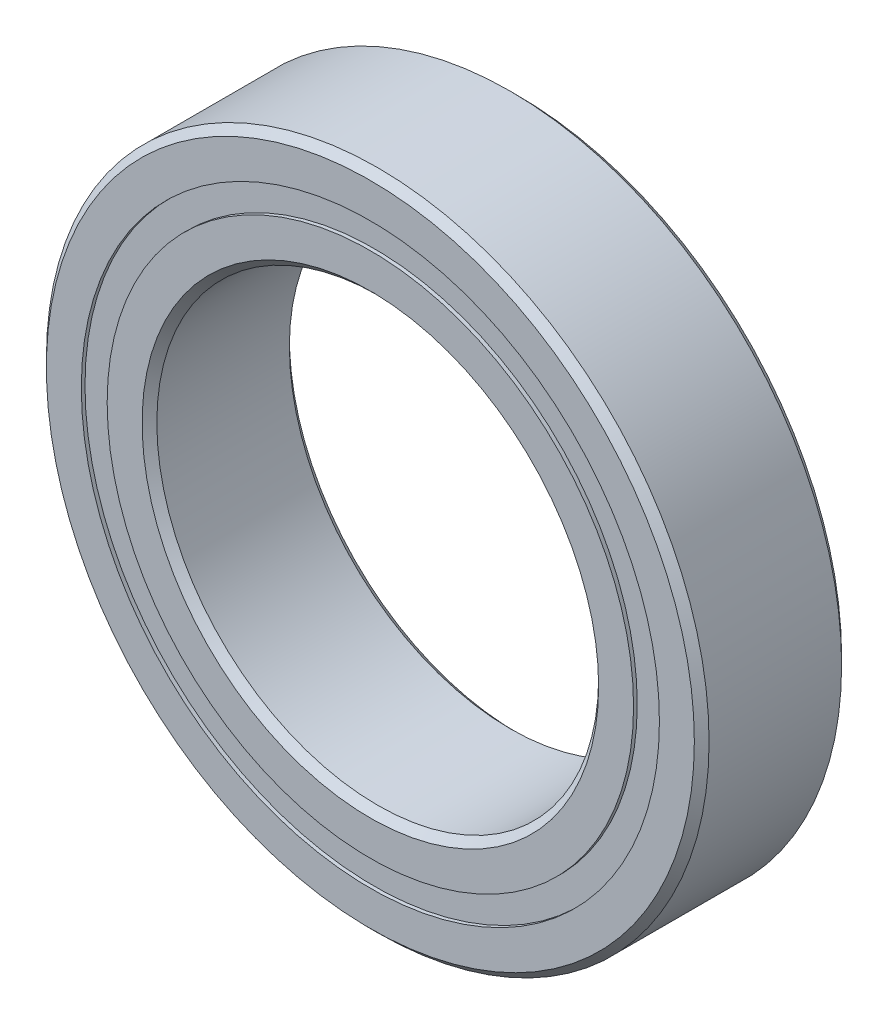
ISO-10303-21;
HEADER;
FILE_DESCRIPTION(('STEP AP214'),'2;1');
FILE_NAME('part.step','',(''),(''),'','','');
FILE_SCHEMA(('AUTOMOTIVE_DESIGN { 1 0 10303 214 1 1 1 1 }'));
ENDSEC;
DATA;
#1=APPLICATION_CONTEXT('core data for automotive mechanical design processes');
#2=APPLICATION_PROTOCOL_DEFINITION('international standard','automotive_design',2000,#1);
#3=PRODUCT_CONTEXT('',#1,'mechanical');
#4=PRODUCT('Part','Part','',(#3));
#5=PRODUCT_RELATED_PRODUCT_CATEGORY('part','',(#4));
#6=PRODUCT_DEFINITION_FORMATION('','',#4);
#7=PRODUCT_DEFINITION_CONTEXT('part definition',#1,'design');
#8=PRODUCT_DEFINITION('design','',#6,#7);
#9=PRODUCT_DEFINITION_SHAPE('','',#8);
#10=(LENGTH_UNIT() NAMED_UNIT(*) SI_UNIT(.MILLI.,.METRE.));
#11=(NAMED_UNIT(*) PLANE_ANGLE_UNIT() SI_UNIT($,.RADIAN.));
#12=(NAMED_UNIT(*) SI_UNIT($,.STERADIAN.) SOLID_ANGLE_UNIT());
#13=UNCERTAINTY_MEASURE_WITH_UNIT(LENGTH_MEASURE(1.E-05),#10,'distance_accuracy_value','');
#14=(GEOMETRIC_REPRESENTATION_CONTEXT(3) GLOBAL_UNCERTAINTY_ASSIGNED_CONTEXT((#13)) GLOBAL_UNIT_ASSIGNED_CONTEXT((#10,
#11,#12)) REPRESENTATION_CONTEXT('',''));
#15=CARTESIAN_POINT('',(0.,0.,0.));
#16=DIRECTION('',(0.,0.,1.));
#17=DIRECTION('',(1.,0.,0.));
#18=AXIS2_PLACEMENT_3D('',#15,#16,#17);
#19=CARTESIAN_POINT('',(0.,7.85114806931288,-1.90000000000001));
#20=DIRECTION('',(0.,0.,1.));
#21=DIRECTION('',(1.,0.,0.));
#22=AXIS2_PLACEMENT_3D('',#19,#20,#21);
#23=PLANE('',#22);
#24=CARTESIAN_POINT('',(0.,0.,-1.90000000000001));
#25=DIRECTION('',(0.,0.,1.));
#26=DIRECTION('',(1.,0.,0.));
#27=AXIS2_PLACEMENT_3D('',#24,#25,#26);
#28=CIRCLE('',#27,7.85114806931288);
#29=CARTESIAN_POINT('',(7.85114806931288,0.,-1.90000000000001));
#30=VERTEX_POINT('',#29);
#31=EDGE_CURVE('E57',#30,#30,#28,.T.);
#32=ORIENTED_EDGE('',*,*,#31,.F.);
#33=EDGE_LOOP('',(#32));
#34=FACE_BOUND('',#33,.T.);
#35=CARTESIAN_POINT('',(0.,0.,-1.90000000000001));
#36=DIRECTION('',(0.,0.,1.));
#37=DIRECTION('',(1.,0.,0.));
#38=AXIS2_PLACEMENT_3D('',#35,#36,#37);
#39=CIRCLE('',#38,7.14885193068713);
#40=CARTESIAN_POINT('',(7.14885193068713,0.,-1.90000000000001));
#41=VERTEX_POINT('',#40);
#42=EDGE_CURVE('E11',#41,#41,#39,.T.);
#43=ORIENTED_EDGE('',*,*,#42,.T.);
#44=EDGE_LOOP('',(#43));
#45=FACE_BOUND('',#44,.T.);
#46=ADVANCED_FACE('F43',(#34,#45),#23,.F.);
#47=CARTESIAN_POINT('',(0.,0.,2.));
#48=DIRECTION('',(0.,0.,1.));
#49=DIRECTION('',(1.,0.,0.));
#50=AXIS2_PLACEMENT_3D('',#47,#48,#49);
#51=CYLINDRICAL_SURFACE('',#50,7.14885193068713);
#52=ORIENTED_EDGE('',*,*,#42,.F.);
#53=EDGE_LOOP('',(#52));
#54=FACE_BOUND('',#53,.T.);
#55=CARTESIAN_POINT('',(0.,0.,-0.803751779515634));
#56=DIRECTION('',(0.,0.,1.));
#57=DIRECTION('',(1.,0.,0.));
#58=AXIS2_PLACEMENT_3D('',#55,#56,#57);
#59=CIRCLE('',#58,7.14885193068713);
#60=CARTESIAN_POINT('',(7.14885193068713,0.,-0.803751779515634));
#61=VERTEX_POINT('',#60);
#62=EDGE_CURVE('E49',#61,#61,#59,.T.);
#63=ORIENTED_EDGE('',*,*,#62,.T.);
#64=EDGE_LOOP('',(#63));
#65=FACE_BOUND('',#64,.T.);
#66=ADVANCED_FACE('F66',(#54,#65),#51,.F.);
#67=CARTESIAN_POINT('',(0.,7.85114806931288,-0.803751779515634));
#68=DIRECTION('',(0.,0.,-1.));
#69=DIRECTION('',(-1.,0.,0.));
#70=AXIS2_PLACEMENT_3D('',#67,#68,#69);
#71=PLANE('',#70);
#72=ORIENTED_EDGE('',*,*,#62,.F.);
#73=EDGE_LOOP('',(#72));
#74=FACE_BOUND('',#73,.T.);
#75=CARTESIAN_POINT('',(0.,0.,-0.803751779515634));
#76=DIRECTION('',(0.,0.,1.));
#77=DIRECTION('',(1.,0.,0.));
#78=AXIS2_PLACEMENT_3D('',#75,#76,#77);
#79=CIRCLE('',#78,7.85114806931288);
#80=CARTESIAN_POINT('',(7.85114806931288,0.,-0.803751779515634));
#81=VERTEX_POINT('',#80);
#82=EDGE_CURVE('E53',#81,#81,#79,.T.);
#83=ORIENTED_EDGE('',*,*,#82,.T.);
#84=EDGE_LOOP('',(#83));
#85=FACE_BOUND('',#84,.T.);
#86=ADVANCED_FACE('F70',(#74,#85),#71,.F.);
#87=CARTESIAN_POINT('',(0.,0.,2.));
#88=DIRECTION('',(0.,0.,1.));
#89=DIRECTION('',(1.,0.,0.));
#90=AXIS2_PLACEMENT_3D('',#87,#88,#89);
#91=CYLINDRICAL_SURFACE('',#90,7.85114806931288);
#92=ORIENTED_EDGE('',*,*,#82,.F.);
#93=EDGE_LOOP('',(#92));
#94=FACE_BOUND('',#93,.T.);
#95=ORIENTED_EDGE('',*,*,#31,.T.);
#96=EDGE_LOOP('',(#95));
#97=FACE_BOUND('',#96,.T.);
#98=ADVANCED_FACE('F63',(#94,#97),#91,.T.);
#99=CLOSED_SHELL('',(#46,#66,#86,#98));
#100=MANIFOLD_SOLID_BREP('B2',#99);
#101=CARTESIAN_POINT('',(0.,7.85114806931288,1.9));
#102=DIRECTION('',(0.,0.,-1.));
#103=DIRECTION('',(-1.,0.,0.));
#104=AXIS2_PLACEMENT_3D('',#101,#102,#103);
#105=PLANE('',#104);
#106=CARTESIAN_POINT('',(0.,0.,1.9));
#107=DIRECTION('',(0.,0.,1.));
#108=DIRECTION('',(1.,0.,0.));
#109=AXIS2_PLACEMENT_3D('',#106,#107,#108);
#110=CIRCLE('',#109,7.14885193068713);
#111=CARTESIAN_POINT('',(7.14885193068713,0.,1.9));
#112=VERTEX_POINT('',#111);
#113=EDGE_CURVE('E42',#112,#112,#110,.T.);
#114=ORIENTED_EDGE('',*,*,#113,.F.);
#115=EDGE_LOOP('',(#114));
#116=FACE_BOUND('',#115,.T.);
#117=CARTESIAN_POINT('',(0.,0.,1.9));
#118=DIRECTION('',(0.,0.,1.));
#119=DIRECTION('',(1.,0.,0.));
#120=AXIS2_PLACEMENT_3D('',#117,#118,#119);
#121=CIRCLE('',#120,7.85114806931288);
#122=CARTESIAN_POINT('',(7.85114806931288,0.,1.9));
#123=VERTEX_POINT('',#122);
#124=EDGE_CURVE('E124',#123,#123,#121,.T.);
#125=ORIENTED_EDGE('',*,*,#124,.T.);
#126=EDGE_LOOP('',(#125));
#127=FACE_BOUND('',#126,.T.);
#128=ADVANCED_FACE('F110',(#116,#127),#105,.F.);
#129=CARTESIAN_POINT('',(0.,0.,2.));
#130=DIRECTION('',(0.,0.,1.));
#131=DIRECTION('',(1.,0.,0.));
#132=AXIS2_PLACEMENT_3D('',#129,#130,#131);
#133=CYLINDRICAL_SURFACE('',#132,7.14885193068713);
#134=CARTESIAN_POINT('',(0.,0.,0.80375177951563));
#135=DIRECTION('',(0.,0.,1.));
#136=DIRECTION('',(1.,0.,0.));
#137=AXIS2_PLACEMENT_3D('',#134,#135,#136);
#138=CIRCLE('',#137,7.14885193068713);
#139=CARTESIAN_POINT('',(7.14885193068713,0.,0.80375177951563));
#140=VERTEX_POINT('',#139);
#141=EDGE_CURVE('E116',#140,#140,#138,.T.);
#142=ORIENTED_EDGE('',*,*,#141,.F.);
#143=EDGE_LOOP('',(#142));
#144=FACE_BOUND('',#143,.T.);
#145=ORIENTED_EDGE('',*,*,#113,.T.);
#146=EDGE_LOOP('',(#145));
#147=FACE_BOUND('',#146,.T.);
#148=ADVANCED_FACE('F139',(#144,#147),#133,.F.);
#149=CARTESIAN_POINT('',(0.,7.85114806931288,0.80375177951563));
#150=DIRECTION('',(0.,0.,1.));
#151=DIRECTION('',(1.,0.,0.));
#152=AXIS2_PLACEMENT_3D('',#149,#150,#151);
#153=PLANE('',#152);
#154=CARTESIAN_POINT('',(0.,0.,0.80375177951563));
#155=DIRECTION('',(0.,0.,1.));
#156=DIRECTION('',(1.,0.,0.));
#157=AXIS2_PLACEMENT_3D('',#154,#155,#156);
#158=CIRCLE('',#157,7.85114806931288);
#159=CARTESIAN_POINT('',(7.85114806931288,0.,0.80375177951563));
#160=VERTEX_POINT('',#159);
#161=EDGE_CURVE('E120',#160,#160,#158,.T.);
#162=ORIENTED_EDGE('',*,*,#161,.F.);
#163=EDGE_LOOP('',(#162));
#164=FACE_BOUND('',#163,.T.);
#165=ORIENTED_EDGE('',*,*,#141,.T.);
#166=EDGE_LOOP('',(#165));
#167=FACE_BOUND('',#166,.T.);
#168=ADVANCED_FACE('F134',(#164,#167),#153,.F.);
#169=CARTESIAN_POINT('',(0.,0.,2.));
#170=DIRECTION('',(0.,0.,1.));
#171=DIRECTION('',(1.,0.,0.));
#172=AXIS2_PLACEMENT_3D('',#169,#170,#171);
#173=CYLINDRICAL_SURFACE('',#172,7.85114806931288);
#174=ORIENTED_EDGE('',*,*,#124,.F.);
#175=EDGE_LOOP('',(#174));
#176=FACE_BOUND('',#175,.T.);
#177=ORIENTED_EDGE('',*,*,#161,.T.);
#178=EDGE_LOOP('',(#177));
#179=FACE_BOUND('',#178,.T.);
#180=ADVANCED_FACE('F131',(#176,#179),#173,.T.);
#181=CLOSED_SHELL('',(#128,#148,#168,#180));
#182=MANIFOLD_SOLID_BREP('B6',#181);
#183=CARTESIAN_POINT('',(-3.77557403465635,6.53948605576281,0.));
#184=DIRECTION('',(0.,0.,1.));
#185=DIRECTION('',(-0.499999999999989,0.866025403784445,0.));
#186=AXIS2_PLACEMENT_3D('',#183,#184,#185);
#187=SPHERICAL_SURFACE('',#186,0.803751779515632);
#188=CARTESIAN_POINT('',(-3.77557403465635,6.53948605576281,0.80375177951563));
#189=VERTEX_POINT('',#188);
#190=VERTEX_LOOP('',#189);
#191=FACE_BOUND('',#190,.T.);
#192=ADVANCED_FACE('F177',(#191),#187,.T.);
#193=CLOSED_SHELL('',(#192));
#194=MANIFOLD_SOLID_BREP('B37',#193);
#195=CARTESIAN_POINT('',(-6.53948605576272,3.77557403465651,0.));
#196=DIRECTION('',(0.,0.,1.));
#197=DIRECTION('',(-0.866025403784433,0.50000000000001,0.));
#198=AXIS2_PLACEMENT_3D('',#195,#196,#197);
#199=SPHERICAL_SURFACE('',#198,0.803751779515632);
#200=CARTESIAN_POINT('',(-6.53948605576272,3.77557403465651,0.80375177951563));
#201=VERTEX_POINT('',#200);
#202=VERTEX_LOOP('',#201);
#203=FACE_BOUND('',#202,.T.);
#204=ADVANCED_FACE('F197',(#203),#199,.T.);
#205=CLOSED_SHELL('',(#204));
#206=MANIFOLD_SOLID_BREP('B106',#205);
#207=CARTESIAN_POINT('',(-7.55114806931288,0.,0.));
#208=DIRECTION('',(0.,0.,1.));
#209=DIRECTION('',(-1.,0.,0.));
#210=AXIS2_PLACEMENT_3D('',#207,#208,#209);
#211=SPHERICAL_SURFACE('',#210,0.803751779515632);
#212=CARTESIAN_POINT('',(-7.55114806931288,0.,0.80375177951563));
#213=VERTEX_POINT('',#212);
#214=VERTEX_LOOP('',#213);
#215=FACE_BOUND('',#214,.T.);
#216=ADVANCED_FACE('F217',(#215),#211,.T.);
#217=CLOSED_SHELL('',(#216));
#218=MANIFOLD_SOLID_BREP('B173',#217);
#219=CARTESIAN_POINT('',(-6.5394860557628,-3.77557403465638,0.));
#220=DIRECTION('',(0.,0.,1.));
#221=DIRECTION('',(-0.866025403784443,-0.499999999999992,0.));
#222=AXIS2_PLACEMENT_3D('',#219,#220,#221);
#223=SPHERICAL_SURFACE('',#222,0.803751779515632);
#224=CARTESIAN_POINT('',(-6.5394860557628,-3.77557403465638,0.80375177951563));
#225=VERTEX_POINT('',#224);
#226=VERTEX_LOOP('',#225);
#227=FACE_BOUND('',#226,.T.);
#228=ADVANCED_FACE('F237',(#227),#223,.T.);
#229=CLOSED_SHELL('',(#228));
#230=MANIFOLD_SOLID_BREP('B193',#229);
#231=CARTESIAN_POINT('',(-3.77557403465649,-6.53948605576274,0.));
#232=DIRECTION('',(0.,0.,1.));
#233=DIRECTION('',(-0.500000000000007,-0.866025403784435,0.));
#234=AXIS2_PLACEMENT_3D('',#231,#232,#233);
#235=SPHERICAL_SURFACE('',#234,0.803751779515632);
#236=CARTESIAN_POINT('',(-3.77557403465649,-6.53948605576274,0.80375177951563));
#237=VERTEX_POINT('',#236);
#238=VERTEX_LOOP('',#237);
#239=FACE_BOUND('',#238,.T.);
#240=ADVANCED_FACE('F257',(#239),#235,.T.);
#241=CLOSED_SHELL('',(#240));
#242=MANIFOLD_SOLID_BREP('B213',#241);
#243=CARTESIAN_POINT('',(0.,-7.55114806931288,0.));
#244=DIRECTION('',(0.,0.,1.));
#245=DIRECTION('',(0.,-1.,0.));
#246=AXIS2_PLACEMENT_3D('',#243,#244,#245);
#247=SPHERICAL_SURFACE('',#246,0.803751779515632);
#248=CARTESIAN_POINT('',(0.,-7.55114806931288,0.80375177951563));
#249=VERTEX_POINT('',#248);
#250=VERTEX_LOOP('',#249);
#251=FACE_BOUND('',#250,.T.);
#252=ADVANCED_FACE('F277',(#251),#247,.T.);
#253=CLOSED_SHELL('',(#252));
#254=MANIFOLD_SOLID_BREP('B233',#253);
#255=CARTESIAN_POINT('',(3.7755740346564,-6.53948605576279,0.));
#256=DIRECTION('',(0.,0.,1.));
#257=DIRECTION('',(0.499999999999995,-0.866025403784442,0.));
#258=AXIS2_PLACEMENT_3D('',#255,#256,#257);
#259=SPHERICAL_SURFACE('',#258,0.803751779515632);
#260=CARTESIAN_POINT('',(3.7755740346564,-6.53948605576279,0.80375177951563));
#261=VERTEX_POINT('',#260);
#262=VERTEX_LOOP('',#261);
#263=FACE_BOUND('',#262,.T.);
#264=ADVANCED_FACE('F297',(#263),#259,.T.);
#265=CLOSED_SHELL('',(#264));
#266=MANIFOLD_SOLID_BREP('B253',#265);
#267=CARTESIAN_POINT('',(6.53948605576275,-3.77557403465647,0.));
#268=DIRECTION('',(0.,0.,1.));
#269=DIRECTION('',(0.866025403784436,-0.500000000000004,0.));
#270=AXIS2_PLACEMENT_3D('',#267,#268,#269);
#271=SPHERICAL_SURFACE('',#270,0.803751779515632);
#272=CARTESIAN_POINT('',(6.53948605576275,-3.77557403465647,0.80375177951563));
#273=VERTEX_POINT('',#272);
#274=VERTEX_LOOP('',#273);
#275=FACE_BOUND('',#274,.T.);
#276=ADVANCED_FACE('F317',(#275),#271,.T.);
#277=CLOSED_SHELL('',(#276));
#278=MANIFOLD_SOLID_BREP('B273',#277);
#279=CARTESIAN_POINT('',(7.55114806931288,0.,0.));
#280=DIRECTION('',(0.,0.,1.));
#281=DIRECTION('',(1.,0.,0.));
#282=AXIS2_PLACEMENT_3D('',#279,#280,#281);
#283=SPHERICAL_SURFACE('',#282,0.803751779515632);
#284=CARTESIAN_POINT('',(7.55114806931288,0.,0.80375177951563));
#285=VERTEX_POINT('',#284);
#286=VERTEX_LOOP('',#285);
#287=FACE_BOUND('',#286,.T.);
#288=ADVANCED_FACE('F337',(#287),#283,.T.);
#289=CLOSED_SHELL('',(#288));
#290=MANIFOLD_SOLID_BREP('B293',#289);
#291=CARTESIAN_POINT('',(6.53948605576278,3.77557403465642,0.));
#292=DIRECTION('',(0.,0.,1.));
#293=DIRECTION('',(0.86602540378444,0.499999999999998,0.));
#294=AXIS2_PLACEMENT_3D('',#291,#292,#293);
#295=SPHERICAL_SURFACE('',#294,0.803751779515632);
#296=CARTESIAN_POINT('',(6.53948605576278,3.77557403465642,0.80375177951563));
#297=VERTEX_POINT('',#296);
#298=VERTEX_LOOP('',#297);
#299=FACE_BOUND('',#298,.T.);
#300=ADVANCED_FACE('F357',(#299),#295,.T.);
#301=CLOSED_SHELL('',(#300));
#302=MANIFOLD_SOLID_BREP('B313',#301);
#303=CARTESIAN_POINT('',(3.77557403465645,6.53948605576276,0.));
#304=DIRECTION('',(0.,0.,1.));
#305=DIRECTION('',(0.500000000000001,0.866025403784438,0.));
#306=AXIS2_PLACEMENT_3D('',#303,#304,#305);
#307=SPHERICAL_SURFACE('',#306,0.803751779515632);
#308=CARTESIAN_POINT('',(3.77557403465645,6.53948605576276,0.80375177951563));
#309=VERTEX_POINT('',#308);
#310=VERTEX_LOOP('',#309);
#311=FACE_BOUND('',#310,.T.);
#312=ADVANCED_FACE('F377',(#311),#307,.T.);
#313=CLOSED_SHELL('',(#312));
#314=MANIFOLD_SOLID_BREP('B333',#313);
#315=CARTESIAN_POINT('',(0.,7.55114806931288,0.));
#316=DIRECTION('',(0.,0.,1.));
#317=DIRECTION('',(0.,1.,0.));
#318=AXIS2_PLACEMENT_3D('',#315,#316,#317);
#319=SPHERICAL_SURFACE('',#318,0.803751779515632);
#320=CARTESIAN_POINT('',(0.,7.55114806931288,0.80375177951563));
#321=VERTEX_POINT('',#320);
#322=VERTEX_LOOP('',#321);
#323=FACE_BOUND('',#322,.T.);
#324=ADVANCED_FACE('F399',(#323),#319,.T.);
#325=CLOSED_SHELL('',(#324));
#326=MANIFOLD_SOLID_BREP('B353',#325);
#327=CARTESIAN_POINT('',(0.,7.14885193068713,2.));
#328=DIRECTION('',(0.,0.,-1.));
#329=DIRECTION('',(-1.,0.,0.));
#330=AXIS2_PLACEMENT_3D('',#327,#328,#329);
#331=PLANE('',#330);
#332=CARTESIAN_POINT('',(0.,0.,2.));
#333=DIRECTION('',(0.,0.,1.));
#334=DIRECTION('',(1.,0.,0.));
#335=AXIS2_PLACEMENT_3D('',#332,#333,#334);
#336=CIRCLE('',#335,6.2);
#337=CARTESIAN_POINT('',(6.2,0.,2.));
#338=VERTEX_POINT('',#337);
#339=EDGE_CURVE('E446',#338,#338,#336,.T.);
#340=ORIENTED_EDGE('',*,*,#339,.F.);
#341=EDGE_LOOP('',(#340));
#342=FACE_BOUND('',#341,.T.);
#343=CARTESIAN_POINT('',(0.,0.,2.));
#344=DIRECTION('',(0.,0.,1.));
#345=DIRECTION('',(1.,0.,0.));
#346=AXIS2_PLACEMENT_3D('',#343,#344,#345);
#347=CIRCLE('',#346,7.14885193068713);
#348=CARTESIAN_POINT('',(7.14885193068713,0.,2.));
#349=VERTEX_POINT('',#348);
#350=EDGE_CURVE('E398',#349,#349,#347,.T.);
#351=ORIENTED_EDGE('',*,*,#350,.T.);
#352=EDGE_LOOP('',(#351));
#353=FACE_BOUND('',#352,.T.);
#354=ADVANCED_FACE('F418',(#342,#353),#331,.F.);
#355=CARTESIAN_POINT('',(0.,0.,2.));
#356=DIRECTION('',(0.,0.,1.));
#357=DIRECTION('',(1.,0.,0.));
#358=AXIS2_PLACEMENT_3D('',#355,#356,#357);
#359=CYLINDRICAL_SURFACE('',#358,7.14885193068713);
#360=ORIENTED_EDGE('',*,*,#350,.F.);
#361=EDGE_LOOP('',(#360));
#362=FACE_BOUND('',#361,.T.);
#363=CARTESIAN_POINT('',(0.,0.,0.888888888888887));
#364=DIRECTION('',(0.,0.,1.));
#365=DIRECTION('',(1.,0.,0.));
#366=AXIS2_PLACEMENT_3D('',#363,#364,#365);
#367=CIRCLE('',#366,7.14885193068713);
#368=CARTESIAN_POINT('',(7.14885193068713,0.,0.888888888888887));
#369=VERTEX_POINT('',#368);
#370=EDGE_CURVE('E424',#369,#369,#367,.T.);
#371=ORIENTED_EDGE('',*,*,#370,.T.);
#372=EDGE_LOOP('',(#371));
#373=FACE_BOUND('',#372,.T.);
#374=ADVANCED_FACE('F453',(#362,#373),#359,.T.);
#375=CARTESIAN_POINT('',(0.,0.,0.));
#376=DIRECTION('',(0.,0.,1.));
#377=DIRECTION('',(1.,0.,0.));
#378=AXIS2_PLACEMENT_3D('',#375,#376,#377);
#379=TOROIDAL_SURFACE('',#378,7.44885193068713,0.938148952347184);
#380=ORIENTED_EDGE('',*,*,#370,.F.);
#381=EDGE_LOOP('',(#380));
#382=FACE_BOUND('',#381,.T.);
#383=CARTESIAN_POINT('',(0.,0.,-0.888888888888889));
#384=DIRECTION('',(0.,0.,1.));
#385=DIRECTION('',(1.,0.,0.));
#386=AXIS2_PLACEMENT_3D('',#383,#384,#385);
#387=CIRCLE('',#386,7.14885193068713);
#388=CARTESIAN_POINT('',(7.14885193068713,0.,-0.888888888888889));
#389=VERTEX_POINT('',#388);
#390=EDGE_CURVE('E428',#389,#389,#387,.T.);
#391=ORIENTED_EDGE('',*,*,#390,.T.);
#392=EDGE_LOOP('',(#391));
#393=FACE_BOUND('',#392,.T.);
#394=ADVANCED_FACE('F457',(#382,#393),#379,.F.);
#395=CARTESIAN_POINT('',(0.,0.,2.));
#396=DIRECTION('',(0.,0.,1.));
#397=DIRECTION('',(1.,0.,0.));
#398=AXIS2_PLACEMENT_3D('',#395,#396,#397);
#399=CYLINDRICAL_SURFACE('',#398,7.14885193068713);
#400=ORIENTED_EDGE('',*,*,#390,.F.);
#401=EDGE_LOOP('',(#400));
#402=FACE_BOUND('',#401,.T.);
#403=CARTESIAN_POINT('',(0.,0.,-2.));
#404=DIRECTION('',(0.,0.,1.));
#405=DIRECTION('',(1.,0.,0.));
#406=AXIS2_PLACEMENT_3D('',#403,#404,#405);
#407=CIRCLE('',#406,7.14885193068713);
#408=CARTESIAN_POINT('',(7.14885193068713,0.,-2.));
#409=VERTEX_POINT('',#408);
#410=EDGE_CURVE('E432',#409,#409,#407,.T.);
#411=ORIENTED_EDGE('',*,*,#410,.T.);
#412=EDGE_LOOP('',(#411));
#413=FACE_BOUND('',#412,.T.);
#414=ADVANCED_FACE('F462',(#402,#413),#399,.T.);
#415=CARTESIAN_POINT('',(0.,6.2,-2.));
#416=DIRECTION('',(0.,0.,1.));
#417=DIRECTION('',(1.,0.,0.));
#418=AXIS2_PLACEMENT_3D('',#415,#416,#417);
#419=PLANE('',#418);
#420=ORIENTED_EDGE('',*,*,#410,.F.);
#421=EDGE_LOOP('',(#420));
#422=FACE_BOUND('',#421,.T.);
#423=CARTESIAN_POINT('',(0.,0.,-2.));
#424=DIRECTION('',(0.,0.,1.));
#425=DIRECTION('',(1.,0.,0.));
#426=AXIS2_PLACEMENT_3D('',#423,#424,#425);
#427=CIRCLE('',#426,6.2);
#428=CARTESIAN_POINT('',(6.2,0.,-2.));
#429=VERTEX_POINT('',#428);
#430=EDGE_CURVE('E437',#429,#429,#427,.T.);
#431=ORIENTED_EDGE('',*,*,#430,.T.);
#432=EDGE_LOOP('',(#431));
#433=FACE_BOUND('',#432,.T.);
#434=ADVANCED_FACE('F468',(#422,#433),#419,.F.);
#435=CARTESIAN_POINT('',(0.,0.,-1.8));
#436=DIRECTION('',(0.,0.,-1.));
#437=DIRECTION('',(-1.,0.,0.));
#438=AXIS2_PLACEMENT_3D('',#435,#436,#437);
#439=CONICAL_SURFACE('',#438,6.,0.785398163397437);
#440=ORIENTED_EDGE('',*,*,#430,.F.);
#441=EDGE_LOOP('',(#440));
#442=FACE_BOUND('',#441,.T.);
#443=CARTESIAN_POINT('',(0.,0.,-1.8));
#444=DIRECTION('',(0.,0.,1.));
#445=DIRECTION('',(1.,0.,0.));
#446=AXIS2_PLACEMENT_3D('',#443,#444,#445);
#447=CIRCLE('',#446,6.);
#448=CARTESIAN_POINT('',(6.,0.,-1.8));
#449=VERTEX_POINT('',#448);
#450=EDGE_CURVE('E440',#449,#449,#447,.T.);
#451=ORIENTED_EDGE('',*,*,#450,.T.);
#452=EDGE_LOOP('',(#451));
#453=FACE_BOUND('',#452,.T.);
#454=ADVANCED_FACE('F472',(#442,#453),#439,.F.);
#455=CARTESIAN_POINT('',(0.,0.,2.));
#456=DIRECTION('',(0.,0.,1.));
#457=DIRECTION('',(1.,0.,0.));
#458=AXIS2_PLACEMENT_3D('',#455,#456,#457);
#459=CYLINDRICAL_SURFACE('',#458,6.);
#460=ORIENTED_EDGE('',*,*,#450,.F.);
#461=EDGE_LOOP('',(#460));
#462=FACE_BOUND('',#461,.T.);
#463=CARTESIAN_POINT('',(0.,0.,1.8));
#464=DIRECTION('',(0.,0.,1.));
#465=DIRECTION('',(1.,0.,0.));
#466=AXIS2_PLACEMENT_3D('',#463,#464,#465);
#467=CIRCLE('',#466,6.);
#468=CARTESIAN_POINT('',(6.,0.,1.8));
#469=VERTEX_POINT('',#468);
#470=EDGE_CURVE('E443',#469,#469,#467,.T.);
#471=ORIENTED_EDGE('',*,*,#470,.T.);
#472=EDGE_LOOP('',(#471));
#473=FACE_BOUND('',#472,.T.);
#474=ADVANCED_FACE('F476',(#462,#473),#459,.F.);
#475=CARTESIAN_POINT('',(0.,0.,2.));
#476=DIRECTION('',(0.,0.,1.));
#477=DIRECTION('',(1.,0.,0.));
#478=AXIS2_PLACEMENT_3D('',#475,#476,#477);
#479=CONICAL_SURFACE('',#478,6.2,0.785398163397461);
#480=ORIENTED_EDGE('',*,*,#470,.F.);
#481=EDGE_LOOP('',(#480));
#482=FACE_BOUND('',#481,.T.);
#483=ORIENTED_EDGE('',*,*,#339,.T.);
#484=EDGE_LOOP('',(#483));
#485=FACE_BOUND('',#484,.T.);
#486=ADVANCED_FACE('F450',(#482,#485),#479,.F.);
#487=CLOSED_SHELL('',(#354,#374,#394,#414,#434,#454,#474,#486));
#488=MANIFOLD_SOLID_BREP('B373',#487);
#489=CARTESIAN_POINT('',(0.,0.,1.8));
#490=DIRECTION('',(0.,0.,-1.));
#491=DIRECTION('',(-1.,0.,0.));
#492=AXIS2_PLACEMENT_3D('',#489,#490,#491);
#493=CONICAL_SURFACE('',#492,9.,0.785398163397446);
#494=CARTESIAN_POINT('',(0.,0.,2.));
#495=DIRECTION('',(0.,0.,1.));
#496=DIRECTION('',(1.,0.,0.));
#497=AXIS2_PLACEMENT_3D('',#494,#495,#496);
#498=CIRCLE('',#497,8.8);
#499=CARTESIAN_POINT('',(8.8,0.,2.));
#500=VERTEX_POINT('',#499);
#501=EDGE_CURVE('E567',#500,#500,#498,.T.);
#502=ORIENTED_EDGE('',*,*,#501,.F.);
#503=EDGE_LOOP('',(#502));
#504=FACE_BOUND('',#503,.T.);
#505=CARTESIAN_POINT('',(0.,0.,1.8));
#506=DIRECTION('',(0.,0.,1.));
#507=DIRECTION('',(1.,0.,0.));
#508=AXIS2_PLACEMENT_3D('',#505,#506,#507);
#509=CIRCLE('',#508,9.);
#510=CARTESIAN_POINT('',(9.,0.,1.8));
#511=VERTEX_POINT('',#510);
#512=EDGE_CURVE('E417',#511,#511,#509,.T.);
#513=ORIENTED_EDGE('',*,*,#512,.T.);
#514=EDGE_LOOP('',(#513));
#515=FACE_BOUND('',#514,.T.);
#516=ADVANCED_FACE('F539',(#504,#515),#493,.T.);
#517=CARTESIAN_POINT('',(0.,0.,2.));
#518=DIRECTION('',(0.,0.,1.));
#519=DIRECTION('',(1.,0.,0.));
#520=AXIS2_PLACEMENT_3D('',#517,#518,#519);
#521=CYLINDRICAL_SURFACE('',#520,9.);
#522=ORIENTED_EDGE('',*,*,#512,.F.);
#523=EDGE_LOOP('',(#522));
#524=FACE_BOUND('',#523,.T.);
#525=CARTESIAN_POINT('',(0.,0.,-1.8));
#526=DIRECTION('',(0.,0.,1.));
#527=DIRECTION('',(1.,0.,0.));
#528=AXIS2_PLACEMENT_3D('',#525,#526,#527);
#529=CIRCLE('',#528,9.);
#530=CARTESIAN_POINT('',(9.,0.,-1.8));
#531=VERTEX_POINT('',#530);
#532=EDGE_CURVE('E545',#531,#531,#529,.T.);
#533=ORIENTED_EDGE('',*,*,#532,.T.);
#534=EDGE_LOOP('',(#533));
#535=FACE_BOUND('',#534,.T.);
#536=ADVANCED_FACE('F574',(#524,#535),#521,.T.);
#537=CARTESIAN_POINT('',(0.,0.,-2.));
#538=DIRECTION('',(0.,0.,1.));
#539=DIRECTION('',(1.,0.,0.));
#540=AXIS2_PLACEMENT_3D('',#537,#538,#539);
#541=CONICAL_SURFACE('',#540,8.8,0.785398163397444);
#542=ORIENTED_EDGE('',*,*,#532,.F.);
#543=EDGE_LOOP('',(#542));
#544=FACE_BOUND('',#543,.T.);
#545=CARTESIAN_POINT('',(0.,0.,-2.));
#546=DIRECTION('',(0.,0.,1.));
#547=DIRECTION('',(1.,0.,0.));
#548=AXIS2_PLACEMENT_3D('',#545,#546,#547);
#549=CIRCLE('',#548,8.8);
#550=CARTESIAN_POINT('',(8.8,0.,-2.));
#551=VERTEX_POINT('',#550);
#552=EDGE_CURVE('E549',#551,#551,#549,.T.);
#553=ORIENTED_EDGE('',*,*,#552,.T.);
#554=EDGE_LOOP('',(#553));
#555=FACE_BOUND('',#554,.T.);
#556=ADVANCED_FACE('F578',(#544,#555),#541,.T.);
#557=CARTESIAN_POINT('',(0.,8.8,-2.));
#558=DIRECTION('',(0.,0.,1.));
#559=DIRECTION('',(1.,0.,0.));
#560=AXIS2_PLACEMENT_3D('',#557,#558,#559);
#561=PLANE('',#560);
#562=ORIENTED_EDGE('',*,*,#552,.F.);
#563=EDGE_LOOP('',(#562));
#564=FACE_BOUND('',#563,.T.);
#565=CARTESIAN_POINT('',(0.,0.,-2.00000000000001));
#566=DIRECTION('',(0.,0.,1.));
#567=DIRECTION('',(1.,0.,0.));
#568=AXIS2_PLACEMENT_3D('',#565,#566,#567);
#569=CIRCLE('',#568,7.85114806931288);
#570=CARTESIAN_POINT('',(7.85114806931288,0.,-2.00000000000001));
#571=VERTEX_POINT('',#570);
#572=EDGE_CURVE('E553',#571,#571,#569,.T.);
#573=ORIENTED_EDGE('',*,*,#572,.T.);
#574=EDGE_LOOP('',(#573));
#575=FACE_BOUND('',#574,.T.);
#576=ADVANCED_FACE('F583',(#564,#575),#561,.F.);
#577=CARTESIAN_POINT('',(0.,0.,2.));
#578=DIRECTION('',(0.,0.,1.));
#579=DIRECTION('',(1.,0.,0.));
#580=AXIS2_PLACEMENT_3D('',#577,#578,#579);
#581=CYLINDRICAL_SURFACE('',#580,7.85114806931288);
#582=ORIENTED_EDGE('',*,*,#572,.F.);
#583=EDGE_LOOP('',(#582));
#584=FACE_BOUND('',#583,.T.);
#585=CARTESIAN_POINT('',(0.,0.,-0.888888888888891));
#586=DIRECTION('',(0.,0.,1.));
#587=DIRECTION('',(1.,0.,0.));
#588=AXIS2_PLACEMENT_3D('',#585,#586,#587);
#589=CIRCLE('',#588,7.85114806931288);
#590=CARTESIAN_POINT('',(7.85114806931288,0.,-0.888888888888891));
#591=VERTEX_POINT('',#590);
#592=EDGE_CURVE('E558',#591,#591,#589,.T.);
#593=ORIENTED_EDGE('',*,*,#592,.T.);
#594=EDGE_LOOP('',(#593));
#595=FACE_BOUND('',#594,.T.);
#596=ADVANCED_FACE('F589',(#584,#595),#581,.F.);
#597=CARTESIAN_POINT('',(0.,0.,0.));
#598=DIRECTION('',(0.,0.,1.));
#599=DIRECTION('',(1.,0.,0.));
#600=AXIS2_PLACEMENT_3D('',#597,#598,#599);
#601=TOROIDAL_SURFACE('',#600,7.55114806931288,0.938148952347186);
#602=ORIENTED_EDGE('',*,*,#592,.F.);
#603=EDGE_LOOP('',(#602));
#604=FACE_BOUND('',#603,.T.);
#605=CARTESIAN_POINT('',(0.,0.,0.888888888888887));
#606=DIRECTION('',(0.,0.,1.));
#607=DIRECTION('',(1.,0.,0.));
#608=AXIS2_PLACEMENT_3D('',#605,#606,#607);
#609=CIRCLE('',#608,7.85114806931288);
#610=CARTESIAN_POINT('',(7.85114806931288,0.,0.888888888888887));
#611=VERTEX_POINT('',#610);
#612=EDGE_CURVE('E561',#611,#611,#609,.T.);
#613=ORIENTED_EDGE('',*,*,#612,.T.);
#614=EDGE_LOOP('',(#613));
#615=FACE_BOUND('',#614,.T.);
#616=ADVANCED_FACE('F593',(#604,#615),#601,.F.);
#617=CARTESIAN_POINT('',(0.,0.,2.));
#618=DIRECTION('',(0.,0.,1.));
#619=DIRECTION('',(1.,0.,0.));
#620=AXIS2_PLACEMENT_3D('',#617,#618,#619);
#621=CYLINDRICAL_SURFACE('',#620,7.85114806931288);
#622=ORIENTED_EDGE('',*,*,#612,.F.);
#623=EDGE_LOOP('',(#622));
#624=FACE_BOUND('',#623,.T.);
#625=CARTESIAN_POINT('',(0.,0.,2.));
#626=DIRECTION('',(0.,0.,1.));
#627=DIRECTION('',(1.,0.,0.));
#628=AXIS2_PLACEMENT_3D('',#625,#626,#627);
#629=CIRCLE('',#628,7.85114806931288);
#630=CARTESIAN_POINT('',(7.85114806931288,0.,2.));
#631=VERTEX_POINT('',#630);
#632=EDGE_CURVE('E564',#631,#631,#629,.T.);
#633=ORIENTED_EDGE('',*,*,#632,.T.);
#634=EDGE_LOOP('',(#633));
#635=FACE_BOUND('',#634,.T.);
#636=ADVANCED_FACE('F597',(#624,#635),#621,.F.);
#637=CARTESIAN_POINT('',(0.,8.8,2.));
#638=DIRECTION('',(0.,0.,-1.));
#639=DIRECTION('',(-1.,0.,0.));
#640=AXIS2_PLACEMENT_3D('',#637,#638,#639);
#641=PLANE('',#640);
#642=ORIENTED_EDGE('',*,*,#632,.F.);
#643=EDGE_LOOP('',(#642));
#644=FACE_BOUND('',#643,.T.);
#645=ORIENTED_EDGE('',*,*,#501,.T.);
#646=EDGE_LOOP('',(#645));
#647=FACE_BOUND('',#646,.T.);
#648=ADVANCED_FACE('F571',(#644,#647),#641,.F.);
#649=CLOSED_SHELL('',(#516,#536,#556,#576,#596,#616,#636,#648));
#650=MANIFOLD_SOLID_BREP('B393',#649);
#651=ADVANCED_BREP_SHAPE_REPRESENTATION('',(#18,#100,#182,#194,#206,#218,#230,#242,#254,#266,
#278,#290,#302,#314,#326,#488,#650),#14);
#652=SHAPE_DEFINITION_REPRESENTATION(#9,#651);
ENDSEC;
END-ISO-10303-21;
